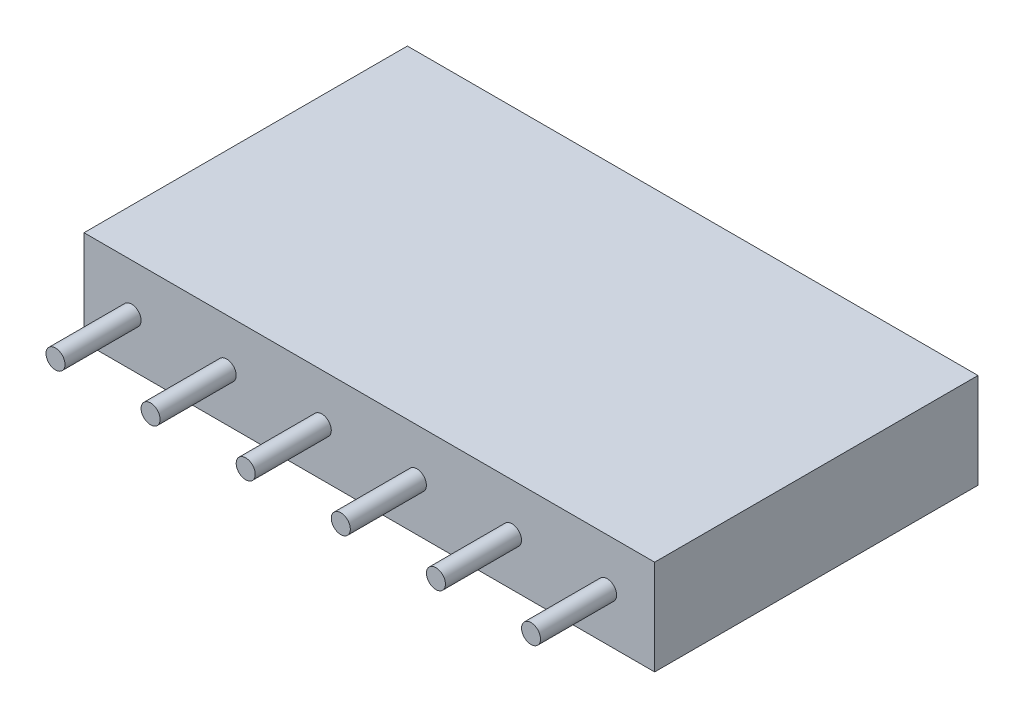
ISO-10303-21;
HEADER;
FILE_DESCRIPTION(('STEP AP214'),'2;1');
FILE_NAME('part.step','',(''),(''),'','','');
FILE_SCHEMA(('AUTOMOTIVE_DESIGN { 1 0 10303 214 1 1 1 1 }'));
ENDSEC;
DATA;
#1=APPLICATION_CONTEXT('core data for automotive mechanical design processes');
#2=APPLICATION_PROTOCOL_DEFINITION('international standard','automotive_design',2000,#1);
#3=PRODUCT_CONTEXT('',#1,'mechanical');
#4=PRODUCT('Part','Part','',(#3));
#5=PRODUCT_RELATED_PRODUCT_CATEGORY('part','',(#4));
#6=PRODUCT_DEFINITION_FORMATION('','',#4);
#7=PRODUCT_DEFINITION_CONTEXT('part definition',#1,'design');
#8=PRODUCT_DEFINITION('design','',#6,#7);
#9=PRODUCT_DEFINITION_SHAPE('','',#8);
#10=(LENGTH_UNIT() NAMED_UNIT(*) SI_UNIT(.MILLI.,.METRE.));
#11=(NAMED_UNIT(*) PLANE_ANGLE_UNIT() SI_UNIT($,.RADIAN.));
#12=(NAMED_UNIT(*) SI_UNIT($,.STERADIAN.) SOLID_ANGLE_UNIT());
#13=UNCERTAINTY_MEASURE_WITH_UNIT(LENGTH_MEASURE(1.E-05),#10,'distance_accuracy_value','');
#14=(GEOMETRIC_REPRESENTATION_CONTEXT(3) GLOBAL_UNCERTAINTY_ASSIGNED_CONTEXT((#13)) GLOBAL_UNIT_ASSIGNED_CONTEXT((#10,
#11,#12)) REPRESENTATION_CONTEXT('',''));
#15=CARTESIAN_POINT('',(0.,0.,0.));
#16=DIRECTION('',(0.,0.,1.));
#17=DIRECTION('',(1.,0.,0.));
#18=AXIS2_PLACEMENT_3D('',#15,#16,#17);
#19=CARTESIAN_POINT('',(-13.75,1.25,10.5));
#20=DIRECTION('',(0.,0.,1.));
#21=DIRECTION('',(1.,0.,0.));
#22=AXIS2_PLACEMENT_3D('',#19,#20,#21);
#23=PLANE('',#22);
#24=CARTESIAN_POINT('',(-13.75,1.25,10.5));
#25=DIRECTION('',(0.,0.,1.));
#26=DIRECTION('',(1.,0.,0.));
#27=AXIS2_PLACEMENT_3D('',#24,#25,#26);
#28=CIRCLE('',#27,0.25);
#29=CARTESIAN_POINT('',(-13.5,1.25,10.5));
#30=VERTEX_POINT('',#29);
#31=EDGE_CURVE('E11',#30,#30,#28,.T.);
#32=ORIENTED_EDGE('',*,*,#31,.T.);
#33=EDGE_LOOP('',(#32));
#34=FACE_BOUND('',#33,.T.);
#35=ADVANCED_FACE('F33',(#34),#23,.T.);
#36=CARTESIAN_POINT('',(-13.75,1.25,10.5));
#37=DIRECTION('',(0.,0.,-1.));
#38=DIRECTION('',(-1.,0.,0.));
#39=AXIS2_PLACEMENT_3D('',#36,#37,#38);
#40=CYLINDRICAL_SURFACE('',#39,0.25);
#41=ORIENTED_EDGE('',*,*,#31,.F.);
#42=EDGE_LOOP('',(#41));
#43=FACE_BOUND('',#42,.T.);
#44=CARTESIAN_POINT('',(-13.75,1.25,8.5));
#45=DIRECTION('',(0.,0.,1.));
#46=DIRECTION('',(1.,0.,0.));
#47=AXIS2_PLACEMENT_3D('',#44,#45,#46);
#48=CIRCLE('',#47,0.25);
#49=CARTESIAN_POINT('',(-13.5,1.25,8.5));
#50=VERTEX_POINT('',#49);
#51=EDGE_CURVE('E41',#50,#50,#48,.T.);
#52=ORIENTED_EDGE('',*,*,#51,.T.);
#53=EDGE_LOOP('',(#52));
#54=FACE_BOUND('',#53,.T.);
#55=ADVANCED_FACE('F141',(#43,#54),#40,.T.);
#56=CARTESIAN_POINT('',(-11.25,1.25,10.5));
#57=DIRECTION('',(0.,0.,1.));
#58=DIRECTION('',(1.,0.,0.));
#59=AXIS2_PLACEMENT_3D('',#56,#57,#58);
#60=PLANE('',#59);
#61=CARTESIAN_POINT('',(-11.25,1.25,10.5));
#62=DIRECTION('',(0.,0.,1.));
#63=DIRECTION('',(1.,0.,0.));
#64=AXIS2_PLACEMENT_3D('',#61,#62,#63);
#65=CIRCLE('',#64,0.25);
#66=CARTESIAN_POINT('',(-11.,1.25,10.5));
#67=VERTEX_POINT('',#66);
#68=EDGE_CURVE('E136',#67,#67,#65,.T.);
#69=ORIENTED_EDGE('',*,*,#68,.T.);
#70=EDGE_LOOP('',(#69));
#71=FACE_BOUND('',#70,.T.);
#72=ADVANCED_FACE('F164',(#71),#60,.T.);
#73=CARTESIAN_POINT('',(-11.25,1.25,10.5));
#74=DIRECTION('',(0.,0.,-1.));
#75=DIRECTION('',(-1.,0.,0.));
#76=AXIS2_PLACEMENT_3D('',#73,#74,#75);
#77=CYLINDRICAL_SURFACE('',#76,0.25);
#78=ORIENTED_EDGE('',*,*,#68,.F.);
#79=EDGE_LOOP('',(#78));
#80=FACE_BOUND('',#79,.T.);
#81=CARTESIAN_POINT('',(-11.25,1.25,8.5));
#82=DIRECTION('',(0.,0.,1.));
#83=DIRECTION('',(1.,0.,0.));
#84=AXIS2_PLACEMENT_3D('',#81,#82,#83);
#85=CIRCLE('',#84,0.25);
#86=CARTESIAN_POINT('',(-11.,1.25,8.5));
#87=VERTEX_POINT('',#86);
#88=EDGE_CURVE('E133',#87,#87,#85,.T.);
#89=ORIENTED_EDGE('',*,*,#88,.T.);
#90=EDGE_LOOP('',(#89));
#91=FACE_BOUND('',#90,.T.);
#92=ADVANCED_FACE('F170',(#80,#91),#77,.T.);
#93=CARTESIAN_POINT('',(-8.75,1.25,10.5));
#94=DIRECTION('',(0.,0.,1.));
#95=DIRECTION('',(1.,0.,0.));
#96=AXIS2_PLACEMENT_3D('',#93,#94,#95);
#97=PLANE('',#96);
#98=CARTESIAN_POINT('',(-8.75,1.25,10.5));
#99=DIRECTION('',(0.,0.,1.));
#100=DIRECTION('',(1.,0.,0.));
#101=AXIS2_PLACEMENT_3D('',#98,#99,#100);
#102=CIRCLE('',#101,0.25);
#103=CARTESIAN_POINT('',(-8.5,1.25,10.5));
#104=VERTEX_POINT('',#103);
#105=EDGE_CURVE('E130',#104,#104,#102,.T.);
#106=ORIENTED_EDGE('',*,*,#105,.T.);
#107=EDGE_LOOP('',(#106));
#108=FACE_BOUND('',#107,.T.);
#109=ADVANCED_FACE('F176',(#108),#97,.T.);
#110=CARTESIAN_POINT('',(-8.75,1.25,10.5));
#111=DIRECTION('',(0.,0.,-1.));
#112=DIRECTION('',(-1.,0.,0.));
#113=AXIS2_PLACEMENT_3D('',#110,#111,#112);
#114=CYLINDRICAL_SURFACE('',#113,0.25);
#115=ORIENTED_EDGE('',*,*,#105,.F.);
#116=EDGE_LOOP('',(#115));
#117=FACE_BOUND('',#116,.T.);
#118=CARTESIAN_POINT('',(-8.75,1.25,8.5));
#119=DIRECTION('',(0.,0.,1.));
#120=DIRECTION('',(1.,0.,0.));
#121=AXIS2_PLACEMENT_3D('',#118,#119,#120);
#122=CIRCLE('',#121,0.25);
#123=CARTESIAN_POINT('',(-8.5,1.25,8.5));
#124=VERTEX_POINT('',#123);
#125=EDGE_CURVE('E127',#124,#124,#122,.T.);
#126=ORIENTED_EDGE('',*,*,#125,.T.);
#127=EDGE_LOOP('',(#126));
#128=FACE_BOUND('',#127,.T.);
#129=ADVANCED_FACE('F180',(#117,#128),#114,.T.);
#130=CARTESIAN_POINT('',(-6.25,1.25,10.5));
#131=DIRECTION('',(0.,0.,1.));
#132=DIRECTION('',(1.,0.,0.));
#133=AXIS2_PLACEMENT_3D('',#130,#131,#132);
#134=PLANE('',#133);
#135=CARTESIAN_POINT('',(-6.25,1.25,10.5));
#136=DIRECTION('',(0.,0.,1.));
#137=DIRECTION('',(1.,0.,0.));
#138=AXIS2_PLACEMENT_3D('',#135,#136,#137);
#139=CIRCLE('',#138,0.25);
#140=CARTESIAN_POINT('',(-6.,1.25,10.5));
#141=VERTEX_POINT('',#140);
#142=EDGE_CURVE('E124',#141,#141,#139,.T.);
#143=ORIENTED_EDGE('',*,*,#142,.T.);
#144=EDGE_LOOP('',(#143));
#145=FACE_BOUND('',#144,.T.);
#146=ADVANCED_FACE('F184',(#145),#134,.T.);
#147=CARTESIAN_POINT('',(-6.25,1.25,10.5));
#148=DIRECTION('',(0.,0.,-1.));
#149=DIRECTION('',(-1.,0.,0.));
#150=AXIS2_PLACEMENT_3D('',#147,#148,#149);
#151=CYLINDRICAL_SURFACE('',#150,0.25);
#152=ORIENTED_EDGE('',*,*,#142,.F.);
#153=EDGE_LOOP('',(#152));
#154=FACE_BOUND('',#153,.T.);
#155=CARTESIAN_POINT('',(-6.25,1.25,8.5));
#156=DIRECTION('',(0.,0.,1.));
#157=DIRECTION('',(1.,0.,0.));
#158=AXIS2_PLACEMENT_3D('',#155,#156,#157);
#159=CIRCLE('',#158,0.25);
#160=CARTESIAN_POINT('',(-6.,1.25,8.5));
#161=VERTEX_POINT('',#160);
#162=EDGE_CURVE('E121',#161,#161,#159,.T.);
#163=ORIENTED_EDGE('',*,*,#162,.T.);
#164=EDGE_LOOP('',(#163));
#165=FACE_BOUND('',#164,.T.);
#166=ADVANCED_FACE('F188',(#154,#165),#151,.T.);
#167=CARTESIAN_POINT('',(0.,0.,8.5));
#168=DIRECTION('',(-1.,0.,0.));
#169=DIRECTION('',(0.,0.,1.));
#170=AXIS2_PLACEMENT_3D('',#167,#168,#169);
#171=PLANE('',#170);
#172=DIRECTION('',(0.,1.,0.));
#173=VECTOR('',#172,1.);
#174=CARTESIAN_POINT('',(0.,0.,0.));
#175=LINE('',#174,#173);
#176=CARTESIAN_POINT('',(0.,0.,0.));
#177=VERTEX_POINT('',#176);
#178=CARTESIAN_POINT('',(0.,2.5,0.));
#179=VERTEX_POINT('',#178);
#180=EDGE_CURVE('E79',#177,#179,#175,.T.);
#181=ORIENTED_EDGE('',*,*,#180,.T.);
#182=DIRECTION('',(0.,0.,-1.));
#183=VECTOR('',#182,1.);
#184=CARTESIAN_POINT('',(0.,2.5,8.5));
#185=LINE('',#184,#183);
#186=CARTESIAN_POINT('',(0.,2.5,8.5));
#187=VERTEX_POINT('',#186);
#188=EDGE_CURVE('E119',#187,#179,#185,.T.);
#189=ORIENTED_EDGE('',*,*,#188,.F.);
#190=DIRECTION('',(0.,1.,0.));
#191=VECTOR('',#190,1.);
#192=CARTESIAN_POINT('',(0.,0.,8.5));
#193=LINE('',#192,#191);
#194=CARTESIAN_POINT('',(0.,0.,8.5));
#195=VERTEX_POINT('',#194);
#196=EDGE_CURVE('E81',#195,#187,#193,.T.);
#197=ORIENTED_EDGE('',*,*,#196,.F.);
#198=DIRECTION('',(0.,0.,-1.));
#199=VECTOR('',#198,1.);
#200=CARTESIAN_POINT('',(0.,0.,8.5));
#201=LINE('',#200,#199);
#202=EDGE_CURVE('E115',#195,#177,#201,.T.);
#203=ORIENTED_EDGE('',*,*,#202,.T.);
#204=EDGE_LOOP('',(#181,#189,#197,#203));
#205=FACE_BOUND('',#204,.T.);
#206=ADVANCED_FACE('F192',(#205),#171,.F.);
#207=CARTESIAN_POINT('',(0.,2.5,8.5));
#208=DIRECTION('',(0.,-1.,0.));
#209=DIRECTION('',(1.,0.,0.));
#210=AXIS2_PLACEMENT_3D('',#207,#208,#209);
#211=PLANE('',#210);
#212=DIRECTION('',(-1.,0.,0.));
#213=VECTOR('',#212,1.);
#214=CARTESIAN_POINT('',(0.,2.5,0.));
#215=LINE('',#214,#213);
#216=CARTESIAN_POINT('',(-15.,2.5,0.));
#217=VERTEX_POINT('',#216);
#218=EDGE_CURVE('E61',#179,#217,#215,.T.);
#219=ORIENTED_EDGE('',*,*,#218,.T.);
#220=DIRECTION('',(0.,0.,-1.));
#221=VECTOR('',#220,1.);
#222=CARTESIAN_POINT('',(-15.,2.5,8.5));
#223=LINE('',#222,#221);
#224=CARTESIAN_POINT('',(-15.,2.5,8.5));
#225=VERTEX_POINT('',#224);
#226=EDGE_CURVE('E90',#225,#217,#223,.T.);
#227=ORIENTED_EDGE('',*,*,#226,.F.);
#228=DIRECTION('',(-1.,0.,0.));
#229=VECTOR('',#228,1.);
#230=CARTESIAN_POINT('',(0.,2.5,8.5));
#231=LINE('',#230,#229);
#232=EDGE_CURVE('E112',#187,#225,#231,.T.);
#233=ORIENTED_EDGE('',*,*,#232,.F.);
#234=ORIENTED_EDGE('',*,*,#188,.T.);
#235=EDGE_LOOP('',(#219,#227,#233,#234));
#236=FACE_BOUND('',#235,.T.);
#237=ADVANCED_FACE('F154',(#236),#211,.F.);
#238=CARTESIAN_POINT('',(0.,0.,8.5));
#239=DIRECTION('',(0.,1.,0.));
#240=DIRECTION('',(0.,0.,1.));
#241=AXIS2_PLACEMENT_3D('',#238,#239,#240);
#242=PLANE('',#241);
#243=DIRECTION('',(1.,0.,0.));
#244=VECTOR('',#243,1.);
#245=CARTESIAN_POINT('',(0.,0.,0.));
#246=LINE('',#245,#244);
#247=CARTESIAN_POINT('',(-15.,0.,0.));
#248=VERTEX_POINT('',#247);
#249=EDGE_CURVE('E74',#248,#177,#246,.T.);
#250=ORIENTED_EDGE('',*,*,#249,.T.);
#251=ORIENTED_EDGE('',*,*,#202,.F.);
#252=DIRECTION('',(1.,0.,0.));
#253=VECTOR('',#252,1.);
#254=CARTESIAN_POINT('',(0.,0.,8.5));
#255=LINE('',#254,#253);
#256=CARTESIAN_POINT('',(-15.,0.,8.5));
#257=VERTEX_POINT('',#256);
#258=EDGE_CURVE('E49',#257,#195,#255,.T.);
#259=ORIENTED_EDGE('',*,*,#258,.F.);
#260=DIRECTION('',(0.,0.,-1.));
#261=VECTOR('',#260,1.);
#262=CARTESIAN_POINT('',(-15.,0.,8.5));
#263=LINE('',#262,#261);
#264=EDGE_CURVE('E88',#257,#248,#263,.T.);
#265=ORIENTED_EDGE('',*,*,#264,.T.);
#266=EDGE_LOOP('',(#250,#251,#259,#265));
#267=FACE_BOUND('',#266,.T.);
#268=ADVANCED_FACE('F94',(#267),#242,.F.);
#269=CARTESIAN_POINT('',(0.,0.,8.5));
#270=DIRECTION('',(0.,0.,1.));
#271=DIRECTION('',(1.,0.,0.));
#272=AXIS2_PLACEMENT_3D('',#269,#270,#271);
#273=PLANE('',#272);
#274=CARTESIAN_POINT('',(-3.75,1.25,8.5));
#275=DIRECTION('',(0.,0.,1.));
#276=DIRECTION('',(1.,0.,0.));
#277=AXIS2_PLACEMENT_3D('',#274,#275,#276);
#278=CIRCLE('',#277,0.25);
#279=CARTESIAN_POINT('',(-3.5,1.25,8.5));
#280=VERTEX_POINT('',#279);
#281=EDGE_CURVE('E470',#280,#280,#278,.T.);
#282=ORIENTED_EDGE('',*,*,#281,.F.);
#283=EDGE_LOOP('',(#282));
#284=FACE_BOUND('',#283,.T.);
#285=CARTESIAN_POINT('',(-1.25,1.25,8.5));
#286=DIRECTION('',(0.,0.,1.));
#287=DIRECTION('',(1.,0.,0.));
#288=AXIS2_PLACEMENT_3D('',#285,#286,#287);
#289=CIRCLE('',#288,0.25);
#290=CARTESIAN_POINT('',(-1.,1.25,8.5));
#291=VERTEX_POINT('',#290);
#292=EDGE_CURVE('E103',#291,#291,#289,.T.);
#293=ORIENTED_EDGE('',*,*,#292,.F.);
#294=EDGE_LOOP('',(#293));
#295=FACE_BOUND('',#294,.T.);
#296=ORIENTED_EDGE('',*,*,#196,.T.);
#297=ORIENTED_EDGE('',*,*,#232,.T.);
#298=DIRECTION('',(0.,-1.,0.));
#299=VECTOR('',#298,1.);
#300=CARTESIAN_POINT('',(-15.,0.,8.5));
#301=LINE('',#300,#299);
#302=EDGE_CURVE('E91',#225,#257,#301,.T.);
#303=ORIENTED_EDGE('',*,*,#302,.T.);
#304=ORIENTED_EDGE('',*,*,#258,.T.);
#305=EDGE_LOOP('',(#296,#297,#303,#304));
#306=FACE_BOUND('',#305,.T.);
#307=ORIENTED_EDGE('',*,*,#162,.F.);
#308=EDGE_LOOP('',(#307));
#309=FACE_BOUND('',#308,.T.);
#310=ORIENTED_EDGE('',*,*,#125,.F.);
#311=EDGE_LOOP('',(#310));
#312=FACE_BOUND('',#311,.T.);
#313=ORIENTED_EDGE('',*,*,#88,.F.);
#314=EDGE_LOOP('',(#313));
#315=FACE_BOUND('',#314,.T.);
#316=ORIENTED_EDGE('',*,*,#51,.F.);
#317=EDGE_LOOP('',(#316));
#318=FACE_BOUND('',#317,.T.);
#319=ADVANCED_FACE('F143',(#284,#295,#306,#309,#312,#315,#318),#273,.T.);
#320=CARTESIAN_POINT('',(0.,0.,0.));
#321=DIRECTION('',(0.,0.,1.));
#322=DIRECTION('',(1.,0.,0.));
#323=AXIS2_PLACEMENT_3D('',#320,#321,#322);
#324=PLANE('',#323);
#325=CARTESIAN_POINT('',(-3.75,1.25,0.));
#326=DIRECTION('',(0.,0.,-1.));
#327=DIRECTION('',(-1.,0.,0.));
#328=AXIS2_PLACEMENT_3D('',#325,#326,#327);
#329=CIRCLE('',#328,0.25);
#330=CARTESIAN_POINT('',(-4.,1.25,0.));
#331=VERTEX_POINT('',#330);
#332=EDGE_CURVE('E471',#331,#331,#329,.T.);
#333=ORIENTED_EDGE('',*,*,#332,.F.);
#334=EDGE_LOOP('',(#333));
#335=FACE_BOUND('',#334,.T.);
#336=CARTESIAN_POINT('',(-6.25,1.25,0.));
#337=DIRECTION('',(0.,0.,-1.));
#338=DIRECTION('',(-1.,0.,0.));
#339=AXIS2_PLACEMENT_3D('',#336,#337,#338);
#340=CIRCLE('',#339,0.25);
#341=CARTESIAN_POINT('',(-6.5,1.25,0.));
#342=VERTEX_POINT('',#341);
#343=EDGE_CURVE('E481',#342,#342,#340,.T.);
#344=ORIENTED_EDGE('',*,*,#343,.F.);
#345=EDGE_LOOP('',(#344));
#346=FACE_BOUND('',#345,.T.);
#347=CARTESIAN_POINT('',(-8.75,1.25,0.));
#348=DIRECTION('',(0.,0.,-1.));
#349=DIRECTION('',(-1.,0.,0.));
#350=AXIS2_PLACEMENT_3D('',#347,#348,#349);
#351=CIRCLE('',#350,0.25);
#352=CARTESIAN_POINT('',(-9.,1.25,0.));
#353=VERTEX_POINT('',#352);
#354=EDGE_CURVE('E487',#353,#353,#351,.T.);
#355=ORIENTED_EDGE('',*,*,#354,.F.);
#356=EDGE_LOOP('',(#355));
#357=FACE_BOUND('',#356,.T.);
#358=CARTESIAN_POINT('',(-11.25,1.25,0.));
#359=DIRECTION('',(0.,0.,-1.));
#360=DIRECTION('',(-1.,0.,0.));
#361=AXIS2_PLACEMENT_3D('',#358,#359,#360);
#362=CIRCLE('',#361,0.25);
#363=CARTESIAN_POINT('',(-11.5,1.25,0.));
#364=VERTEX_POINT('',#363);
#365=EDGE_CURVE('E493',#364,#364,#362,.T.);
#366=ORIENTED_EDGE('',*,*,#365,.F.);
#367=EDGE_LOOP('',(#366));
#368=FACE_BOUND('',#367,.T.);
#369=CARTESIAN_POINT('',(-13.75,1.25,0.));
#370=DIRECTION('',(0.,0.,-1.));
#371=DIRECTION('',(-1.,0.,0.));
#372=AXIS2_PLACEMENT_3D('',#369,#370,#371);
#373=CIRCLE('',#372,0.25);
#374=CARTESIAN_POINT('',(-14.,1.25,0.));
#375=VERTEX_POINT('',#374);
#376=EDGE_CURVE('E499',#375,#375,#373,.T.);
#377=ORIENTED_EDGE('',*,*,#376,.F.);
#378=EDGE_LOOP('',(#377));
#379=FACE_BOUND('',#378,.T.);
#380=CARTESIAN_POINT('',(-1.25,1.25,0.));
#381=DIRECTION('',(0.,0.,-1.));
#382=DIRECTION('',(-1.,0.,0.));
#383=AXIS2_PLACEMENT_3D('',#380,#381,#382);
#384=CIRCLE('',#383,0.25);
#385=CARTESIAN_POINT('',(-1.5,1.25,0.));
#386=VERTEX_POINT('',#385);
#387=EDGE_CURVE('E96',#386,#386,#384,.T.);
#388=ORIENTED_EDGE('',*,*,#387,.F.);
#389=EDGE_LOOP('',(#388));
#390=FACE_BOUND('',#389,.T.);
#391=ORIENTED_EDGE('',*,*,#180,.F.);
#392=ORIENTED_EDGE('',*,*,#249,.F.);
#393=DIRECTION('',(0.,-1.,0.));
#394=VECTOR('',#393,1.);
#395=CARTESIAN_POINT('',(-15.,0.,0.));
#396=LINE('',#395,#394);
#397=EDGE_CURVE('E77',#217,#248,#396,.T.);
#398=ORIENTED_EDGE('',*,*,#397,.F.);
#399=ORIENTED_EDGE('',*,*,#218,.F.);
#400=EDGE_LOOP('',(#391,#392,#398,#399));
#401=FACE_BOUND('',#400,.T.);
#402=ADVANCED_FACE('F76',(#335,#346,#357,#368,#379,#390,#401),#324,.F.);
#403=CARTESIAN_POINT('',(-1.25,1.25,10.5));
#404=DIRECTION('',(0.,0.,-1.));
#405=DIRECTION('',(-1.,0.,0.));
#406=AXIS2_PLACEMENT_3D('',#403,#404,#405);
#407=CYLINDRICAL_SURFACE('',#406,0.25);
#408=CARTESIAN_POINT('',(-1.25,1.25,10.5));
#409=DIRECTION('',(0.,0.,1.));
#410=DIRECTION('',(1.,0.,0.));
#411=AXIS2_PLACEMENT_3D('',#408,#409,#410);
#412=CIRCLE('',#411,0.25);
#413=CARTESIAN_POINT('',(-1.,1.25,10.5));
#414=VERTEX_POINT('',#413);
#415=EDGE_CURVE('E106',#414,#414,#412,.T.);
#416=ORIENTED_EDGE('',*,*,#415,.F.);
#417=EDGE_LOOP('',(#416));
#418=FACE_BOUND('',#417,.T.);
#419=ORIENTED_EDGE('',*,*,#292,.T.);
#420=EDGE_LOOP('',(#419));
#421=FACE_BOUND('',#420,.T.);
#422=ADVANCED_FACE('F151',(#418,#421),#407,.T.);
#423=CARTESIAN_POINT('',(-1.25,1.25,10.5));
#424=DIRECTION('',(0.,0.,1.));
#425=DIRECTION('',(1.,0.,0.));
#426=AXIS2_PLACEMENT_3D('',#423,#424,#425);
#427=PLANE('',#426);
#428=ORIENTED_EDGE('',*,*,#415,.T.);
#429=EDGE_LOOP('',(#428));
#430=FACE_BOUND('',#429,.T.);
#431=ADVANCED_FACE('F376',(#430),#427,.T.);
#432=CARTESIAN_POINT('',(-1.25,1.25,4.));
#433=DIRECTION('',(0.,0.,-1.));
#434=DIRECTION('',(-1.,0.,0.));
#435=AXIS2_PLACEMENT_3D('',#432,#433,#434);
#436=CYLINDRICAL_SURFACE('',#435,0.25);
#437=CARTESIAN_POINT('',(-1.25,1.25,4.));
#438=DIRECTION('',(0.,0.,-1.));
#439=DIRECTION('',(-1.,0.,0.));
#440=AXIS2_PLACEMENT_3D('',#437,#438,#439);
#441=CIRCLE('',#440,0.25);
#442=CARTESIAN_POINT('',(-1.5,1.25,4.));
#443=VERTEX_POINT('',#442);
#444=EDGE_CURVE('E100',#443,#443,#441,.T.);
#445=ORIENTED_EDGE('',*,*,#444,.F.);
#446=EDGE_LOOP('',(#445));
#447=FACE_BOUND('',#446,.T.);
#448=ORIENTED_EDGE('',*,*,#387,.T.);
#449=EDGE_LOOP('',(#448));
#450=FACE_BOUND('',#449,.T.);
#451=ADVANCED_FACE('F372',(#447,#450),#436,.F.);
#452=CARTESIAN_POINT('',(-1.25,1.25,4.));
#453=DIRECTION('',(0.,0.,-1.));
#454=DIRECTION('',(-1.,0.,0.));
#455=AXIS2_PLACEMENT_3D('',#452,#453,#454);
#456=PLANE('',#455);
#457=ORIENTED_EDGE('',*,*,#444,.T.);
#458=EDGE_LOOP('',(#457));
#459=FACE_BOUND('',#458,.T.);
#460=ADVANCED_FACE('F243',(#459),#456,.T.);
#461=CARTESIAN_POINT('',(-15.,0.,8.5));
#462=DIRECTION('',(1.,0.,0.));
#463=DIRECTION('',(0.,0.,-1.));
#464=AXIS2_PLACEMENT_3D('',#461,#462,#463);
#465=PLANE('',#464);
#466=ORIENTED_EDGE('',*,*,#397,.T.);
#467=ORIENTED_EDGE('',*,*,#264,.F.);
#468=ORIENTED_EDGE('',*,*,#302,.F.);
#469=ORIENTED_EDGE('',*,*,#226,.T.);
#470=EDGE_LOOP('',(#466,#467,#468,#469));
#471=FACE_BOUND('',#470,.T.);
#472=ADVANCED_FACE('F86',(#471),#465,.F.);
#473=CARTESIAN_POINT('',(-3.75,1.25,10.5));
#474=DIRECTION('',(0.,0.,-1.));
#475=DIRECTION('',(-1.,0.,0.));
#476=AXIS2_PLACEMENT_3D('',#473,#474,#475);
#477=CYLINDRICAL_SURFACE('',#476,0.25);
#478=CARTESIAN_POINT('',(-3.75,1.25,10.5));
#479=DIRECTION('',(0.,0.,1.));
#480=DIRECTION('',(1.,0.,0.));
#481=AXIS2_PLACEMENT_3D('',#478,#479,#480);
#482=CIRCLE('',#481,0.25);
#483=CARTESIAN_POINT('',(-3.5,1.25,10.5));
#484=VERTEX_POINT('',#483);
#485=EDGE_CURVE('E92',#484,#484,#482,.T.);
#486=ORIENTED_EDGE('',*,*,#485,.F.);
#487=EDGE_LOOP('',(#486));
#488=FACE_BOUND('',#487,.T.);
#489=ORIENTED_EDGE('',*,*,#281,.T.);
#490=EDGE_LOOP('',(#489));
#491=FACE_BOUND('',#490,.T.);
#492=ADVANCED_FACE('F242',(#488,#491),#477,.T.);
#493=CARTESIAN_POINT('',(-3.75,1.25,10.5));
#494=DIRECTION('',(0.,0.,1.));
#495=DIRECTION('',(1.,0.,0.));
#496=AXIS2_PLACEMENT_3D('',#493,#494,#495);
#497=PLANE('',#496);
#498=ORIENTED_EDGE('',*,*,#485,.T.);
#499=EDGE_LOOP('',(#498));
#500=FACE_BOUND('',#499,.T.);
#501=ADVANCED_FACE('F254',(#500),#497,.T.);
#502=CARTESIAN_POINT('',(-13.75,1.25,4.));
#503=DIRECTION('',(0.,0.,-1.));
#504=DIRECTION('',(-1.,0.,0.));
#505=AXIS2_PLACEMENT_3D('',#502,#503,#504);
#506=CYLINDRICAL_SURFACE('',#505,0.25);
#507=CARTESIAN_POINT('',(-13.75,1.25,4.));
#508=DIRECTION('',(0.,0.,-1.));
#509=DIRECTION('',(-1.,0.,0.));
#510=AXIS2_PLACEMENT_3D('',#507,#508,#509);
#511=CIRCLE('',#510,0.25);
#512=CARTESIAN_POINT('',(-14.,1.25,4.));
#513=VERTEX_POINT('',#512);
#514=EDGE_CURVE('E496',#513,#513,#511,.T.);
#515=ORIENTED_EDGE('',*,*,#514,.F.);
#516=EDGE_LOOP('',(#515));
#517=FACE_BOUND('',#516,.T.);
#518=ORIENTED_EDGE('',*,*,#376,.T.);
#519=EDGE_LOOP('',(#518));
#520=FACE_BOUND('',#519,.T.);
#521=ADVANCED_FACE('F265',(#517,#520),#506,.F.);
#522=CARTESIAN_POINT('',(-13.75,1.25,4.));
#523=DIRECTION('',(0.,0.,-1.));
#524=DIRECTION('',(-1.,0.,0.));
#525=AXIS2_PLACEMENT_3D('',#522,#523,#524);
#526=PLANE('',#525);
#527=ORIENTED_EDGE('',*,*,#514,.T.);
#528=EDGE_LOOP('',(#527));
#529=FACE_BOUND('',#528,.T.);
#530=ADVANCED_FACE('F275',(#529),#526,.T.);
#531=CARTESIAN_POINT('',(-11.25,1.25,4.));
#532=DIRECTION('',(0.,0.,-1.));
#533=DIRECTION('',(-1.,0.,0.));
#534=AXIS2_PLACEMENT_3D('',#531,#532,#533);
#535=CYLINDRICAL_SURFACE('',#534,0.25);
#536=CARTESIAN_POINT('',(-11.25,1.25,4.));
#537=DIRECTION('',(0.,0.,-1.));
#538=DIRECTION('',(-1.,0.,0.));
#539=AXIS2_PLACEMENT_3D('',#536,#537,#538);
#540=CIRCLE('',#539,0.25);
#541=CARTESIAN_POINT('',(-11.5,1.25,4.));
#542=VERTEX_POINT('',#541);
#543=EDGE_CURVE('E490',#542,#542,#540,.T.);
#544=ORIENTED_EDGE('',*,*,#543,.F.);
#545=EDGE_LOOP('',(#544));
#546=FACE_BOUND('',#545,.T.);
#547=ORIENTED_EDGE('',*,*,#365,.T.);
#548=EDGE_LOOP('',(#547));
#549=FACE_BOUND('',#548,.T.);
#550=ADVANCED_FACE('F285',(#546,#549),#535,.F.);
#551=CARTESIAN_POINT('',(-11.25,1.25,4.));
#552=DIRECTION('',(0.,0.,-1.));
#553=DIRECTION('',(-1.,0.,0.));
#554=AXIS2_PLACEMENT_3D('',#551,#552,#553);
#555=PLANE('',#554);
#556=ORIENTED_EDGE('',*,*,#543,.T.);
#557=EDGE_LOOP('',(#556));
#558=FACE_BOUND('',#557,.T.);
#559=ADVANCED_FACE('F295',(#558),#555,.T.);
#560=CARTESIAN_POINT('',(-8.75,1.25,4.));
#561=DIRECTION('',(0.,0.,-1.));
#562=DIRECTION('',(-1.,0.,0.));
#563=AXIS2_PLACEMENT_3D('',#560,#561,#562);
#564=CYLINDRICAL_SURFACE('',#563,0.25);
#565=CARTESIAN_POINT('',(-8.75,1.25,4.));
#566=DIRECTION('',(0.,0.,-1.));
#567=DIRECTION('',(-1.,0.,0.));
#568=AXIS2_PLACEMENT_3D('',#565,#566,#567);
#569=CIRCLE('',#568,0.25);
#570=CARTESIAN_POINT('',(-9.,1.25,4.));
#571=VERTEX_POINT('',#570);
#572=EDGE_CURVE('E484',#571,#571,#569,.T.);
#573=ORIENTED_EDGE('',*,*,#572,.F.);
#574=EDGE_LOOP('',(#573));
#575=FACE_BOUND('',#574,.T.);
#576=ORIENTED_EDGE('',*,*,#354,.T.);
#577=EDGE_LOOP('',(#576));
#578=FACE_BOUND('',#577,.T.);
#579=ADVANCED_FACE('F305',(#575,#578),#564,.F.);
#580=CARTESIAN_POINT('',(-8.75,1.25,4.));
#581=DIRECTION('',(0.,0.,-1.));
#582=DIRECTION('',(-1.,0.,0.));
#583=AXIS2_PLACEMENT_3D('',#580,#581,#582);
#584=PLANE('',#583);
#585=ORIENTED_EDGE('',*,*,#572,.T.);
#586=EDGE_LOOP('',(#585));
#587=FACE_BOUND('',#586,.T.);
#588=ADVANCED_FACE('F315',(#587),#584,.T.);
#589=CARTESIAN_POINT('',(-6.25,1.25,4.));
#590=DIRECTION('',(0.,0.,-1.));
#591=DIRECTION('',(-1.,0.,0.));
#592=AXIS2_PLACEMENT_3D('',#589,#590,#591);
#593=CYLINDRICAL_SURFACE('',#592,0.25);
#594=CARTESIAN_POINT('',(-6.25,1.25,4.));
#595=DIRECTION('',(0.,0.,-1.));
#596=DIRECTION('',(-1.,0.,0.));
#597=AXIS2_PLACEMENT_3D('',#594,#595,#596);
#598=CIRCLE('',#597,0.25);
#599=CARTESIAN_POINT('',(-6.5,1.25,4.));
#600=VERTEX_POINT('',#599);
#601=EDGE_CURVE('E476',#600,#600,#598,.T.);
#602=ORIENTED_EDGE('',*,*,#601,.F.);
#603=EDGE_LOOP('',(#602));
#604=FACE_BOUND('',#603,.T.);
#605=ORIENTED_EDGE('',*,*,#343,.T.);
#606=EDGE_LOOP('',(#605));
#607=FACE_BOUND('',#606,.T.);
#608=ADVANCED_FACE('F325',(#604,#607),#593,.F.);
#609=CARTESIAN_POINT('',(-6.25,1.25,4.));
#610=DIRECTION('',(0.,0.,-1.));
#611=DIRECTION('',(-1.,0.,0.));
#612=AXIS2_PLACEMENT_3D('',#609,#610,#611);
#613=PLANE('',#612);
#614=ORIENTED_EDGE('',*,*,#601,.T.);
#615=EDGE_LOOP('',(#614));
#616=FACE_BOUND('',#615,.T.);
#617=ADVANCED_FACE('F335',(#616),#613,.T.);
#618=CARTESIAN_POINT('',(-3.75,1.25,4.));
#619=DIRECTION('',(0.,0.,-1.));
#620=DIRECTION('',(-1.,0.,0.));
#621=AXIS2_PLACEMENT_3D('',#618,#619,#620);
#622=CYLINDRICAL_SURFACE('',#621,0.25);
#623=CARTESIAN_POINT('',(-3.75,1.25,4.));
#624=DIRECTION('',(0.,0.,-1.));
#625=DIRECTION('',(-1.,0.,0.));
#626=AXIS2_PLACEMENT_3D('',#623,#624,#625);
#627=CIRCLE('',#626,0.25);
#628=CARTESIAN_POINT('',(-4.,1.25,4.));
#629=VERTEX_POINT('',#628);
#630=EDGE_CURVE('E469',#629,#629,#627,.T.);
#631=ORIENTED_EDGE('',*,*,#630,.F.);
#632=EDGE_LOOP('',(#631));
#633=FACE_BOUND('',#632,.T.);
#634=ORIENTED_EDGE('',*,*,#332,.T.);
#635=EDGE_LOOP('',(#634));
#636=FACE_BOUND('',#635,.T.);
#637=ADVANCED_FACE('F345',(#633,#636),#622,.F.);
#638=CARTESIAN_POINT('',(-3.75,1.25,4.));
#639=DIRECTION('',(0.,0.,-1.));
#640=DIRECTION('',(-1.,0.,0.));
#641=AXIS2_PLACEMENT_3D('',#638,#639,#640);
#642=PLANE('',#641);
#643=ORIENTED_EDGE('',*,*,#630,.T.);
#644=EDGE_LOOP('',(#643));
#645=FACE_BOUND('',#644,.T.);
#646=ADVANCED_FACE('F355',(#645),#642,.T.);
#647=CLOSED_SHELL('',(#35,#55,#72,#92,#109,#129,#146,#166,#206,#237,#268,#319,#402,#422,#431,
#451,#460,#472,#492,#501,#521,#530,#550,#559,#579,#588,#608,#617,#637,#646));
#648=MANIFOLD_SOLID_BREP('B2',#647);
#649=ADVANCED_BREP_SHAPE_REPRESENTATION('',(#18,#648),#14);
#650=SHAPE_DEFINITION_REPRESENTATION(#9,#649);
ENDSEC;
END-ISO-10303-21;
